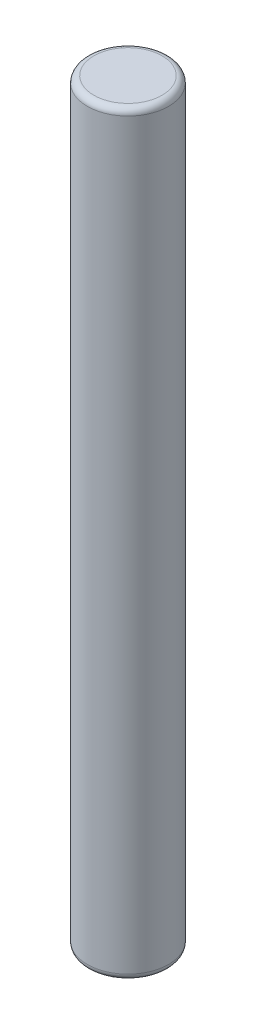
ISO-10303-21;
HEADER;
FILE_DESCRIPTION(('STEP AP214'),'2;1');
FILE_NAME('part.step','',(''),(''),'','','');
FILE_SCHEMA(('AUTOMOTIVE_DESIGN { 1 0 10303 214 1 1 1 1 }'));
ENDSEC;
DATA;
#1=APPLICATION_CONTEXT('core data for automotive mechanical design processes');
#2=APPLICATION_PROTOCOL_DEFINITION('international standard','automotive_design',2000,#1);
#3=PRODUCT_CONTEXT('',#1,'mechanical');
#4=PRODUCT('Part','Part','',(#3));
#5=PRODUCT_RELATED_PRODUCT_CATEGORY('part','',(#4));
#6=PRODUCT_DEFINITION_FORMATION('','',#4);
#7=PRODUCT_DEFINITION_CONTEXT('part definition',#1,'design');
#8=PRODUCT_DEFINITION('design','',#6,#7);
#9=PRODUCT_DEFINITION_SHAPE('','',#8);
#10=(LENGTH_UNIT() NAMED_UNIT(*) SI_UNIT(.MILLI.,.METRE.));
#11=(NAMED_UNIT(*) PLANE_ANGLE_UNIT() SI_UNIT($,.RADIAN.));
#12=(NAMED_UNIT(*) SI_UNIT($,.STERADIAN.) SOLID_ANGLE_UNIT());
#13=UNCERTAINTY_MEASURE_WITH_UNIT(LENGTH_MEASURE(1.E-05),#10,'distance_accuracy_value','');
#14=(GEOMETRIC_REPRESENTATION_CONTEXT(3) GLOBAL_UNCERTAINTY_ASSIGNED_CONTEXT((#13)) GLOBAL_UNIT_ASSIGNED_CONTEXT((#10,
#11,#12)) REPRESENTATION_CONTEXT('',''));
#15=CARTESIAN_POINT('',(0.,0.,0.));
#16=DIRECTION('',(0.,0.,1.));
#17=DIRECTION('',(1.,0.,0.));
#18=AXIS2_PLACEMENT_3D('',#15,#16,#17);
#19=CARTESIAN_POINT('',(0.,74.5,0.));
#20=DIRECTION('',(0.,-1.,0.));
#21=DIRECTION('',(0.,0.,-1.));
#22=AXIS2_PLACEMENT_3D('',#19,#20,#21);
#23=CYLINDRICAL_SURFACE('',#22,4.);
#24=CARTESIAN_POINT('',(0.,73.865,0.));
#25=DIRECTION('',(0.,1.,0.));
#26=DIRECTION('',(0.,0.,1.));
#27=AXIS2_PLACEMENT_3D('',#24,#25,#26);
#28=CIRCLE('',#27,4.);
#29=CARTESIAN_POINT('',(0.,73.865,4.));
#30=VERTEX_POINT('',#29);
#31=EDGE_CURVE('E39',#30,#30,#28,.F.);
#32=ORIENTED_EDGE('',*,*,#31,.T.);
#33=EDGE_LOOP('',(#32));
#34=FACE_BOUND('',#33,.T.);
#35=CARTESIAN_POINT('',(0.,0.634999999999997,0.));
#36=DIRECTION('',(0.,1.,0.));
#37=DIRECTION('',(0.,0.,1.));
#38=AXIS2_PLACEMENT_3D('',#35,#36,#37);
#39=CIRCLE('',#38,4.);
#40=CARTESIAN_POINT('',(0.,0.634999999999997,4.));
#41=VERTEX_POINT('',#40);
#42=EDGE_CURVE('E43',#41,#41,#39,.T.);
#43=ORIENTED_EDGE('',*,*,#42,.T.);
#44=EDGE_LOOP('',(#43));
#45=FACE_BOUND('',#44,.T.);
#46=ADVANCED_FACE('F32',(#34,#45),#23,.T.);
#47=CARTESIAN_POINT('',(0.,74.5,0.));
#48=DIRECTION('',(0.,1.,0.));
#49=DIRECTION('',(0.,0.,1.));
#50=AXIS2_PLACEMENT_3D('',#47,#48,#49);
#51=PLANE('',#50);
#52=CARTESIAN_POINT('',(0.,74.5,0.));
#53=DIRECTION('',(0.,1.,0.));
#54=DIRECTION('',(0.,0.,1.));
#55=AXIS2_PLACEMENT_3D('',#52,#53,#54);
#56=CIRCLE('',#55,3.365);
#57=CARTESIAN_POINT('',(0.,74.5,3.365));
#58=VERTEX_POINT('',#57);
#59=EDGE_CURVE('E47',#58,#58,#56,.T.);
#60=ORIENTED_EDGE('',*,*,#59,.T.);
#61=EDGE_LOOP('',(#60));
#62=FACE_BOUND('',#61,.T.);
#63=ADVANCED_FACE('F53',(#62),#51,.T.);
#64=CARTESIAN_POINT('',(0.,0.,0.));
#65=DIRECTION('',(0.,1.,0.));
#66=DIRECTION('',(0.,0.,1.));
#67=AXIS2_PLACEMENT_3D('',#64,#65,#66);
#68=PLANE('',#67);
#69=CARTESIAN_POINT('',(0.,0.,0.));
#70=DIRECTION('',(0.,1.,0.));
#71=DIRECTION('',(0.,0.,1.));
#72=AXIS2_PLACEMENT_3D('',#69,#70,#71);
#73=CIRCLE('',#72,3.365);
#74=CARTESIAN_POINT('',(0.,0.,3.365));
#75=VERTEX_POINT('',#74);
#76=EDGE_CURVE('E10',#75,#75,#73,.F.);
#77=ORIENTED_EDGE('',*,*,#76,.T.);
#78=EDGE_LOOP('',(#77));
#79=FACE_BOUND('',#78,.T.);
#80=ADVANCED_FACE('F57',(#79),#68,.F.);
#81=CARTESIAN_POINT('',(0.,73.865,0.));
#82=DIRECTION('',(0.,1.,0.));
#83=DIRECTION('',(0.,0.,1.));
#84=AXIS2_PLACEMENT_3D('',#81,#82,#83);
#85=TOROIDAL_SURFACE('',#84,3.365,0.635);
#86=ORIENTED_EDGE('',*,*,#31,.F.);
#87=EDGE_LOOP('',(#86));
#88=FACE_BOUND('',#87,.T.);
#89=ORIENTED_EDGE('',*,*,#59,.F.);
#90=EDGE_LOOP('',(#89));
#91=FACE_BOUND('',#90,.T.);
#92=ADVANCED_FACE('F55',(#88,#91),#85,.T.);
#93=CARTESIAN_POINT('',(0.,0.634999999999997,0.));
#94=DIRECTION('',(0.,1.,0.));
#95=DIRECTION('',(0.,0.,1.));
#96=AXIS2_PLACEMENT_3D('',#93,#94,#95);
#97=TOROIDAL_SURFACE('',#96,3.365,0.635);
#98=ORIENTED_EDGE('',*,*,#76,.F.);
#99=EDGE_LOOP('',(#98));
#100=FACE_BOUND('',#99,.T.);
#101=ORIENTED_EDGE('',*,*,#42,.F.);
#102=EDGE_LOOP('',(#101));
#103=FACE_BOUND('',#102,.T.);
#104=ADVANCED_FACE('F34',(#100,#103),#97,.T.);
#105=CLOSED_SHELL('',(#46,#63,#80,#92,#104));
#106=MANIFOLD_SOLID_BREP('B2',#105);
#107=ADVANCED_BREP_SHAPE_REPRESENTATION('',(#18,#106),#14);
#108=SHAPE_DEFINITION_REPRESENTATION(#9,#107);
ENDSEC;
END-ISO-10303-21;
